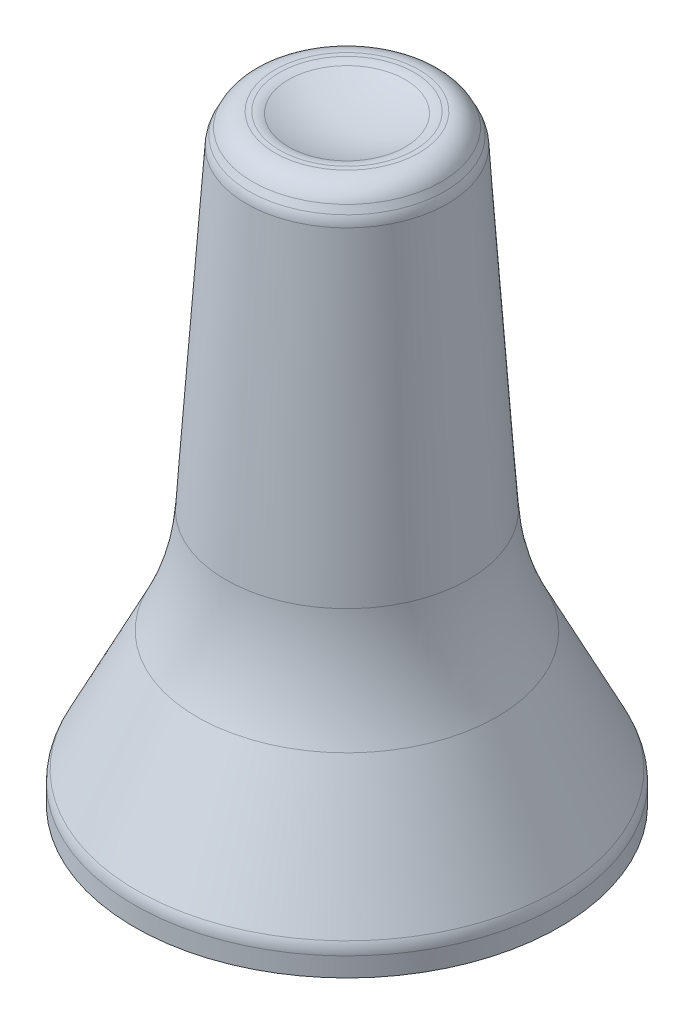
ISO-10303-21;
HEADER;
FILE_DESCRIPTION(('STEP AP214'),'2;1');
FILE_NAME('part.step','',(''),(''),'','','');
FILE_SCHEMA(('AUTOMOTIVE_DESIGN { 1 0 10303 214 1 1 1 1 }'));
ENDSEC;
DATA;
#1=APPLICATION_CONTEXT('core data for automotive mechanical design processes');
#2=APPLICATION_PROTOCOL_DEFINITION('international standard','automotive_design',2000,#1);
#3=PRODUCT_CONTEXT('',#1,'mechanical');
#4=PRODUCT('Part','Part','',(#3));
#5=PRODUCT_RELATED_PRODUCT_CATEGORY('part','',(#4));
#6=PRODUCT_DEFINITION_FORMATION('','',#4);
#7=PRODUCT_DEFINITION_CONTEXT('part definition',#1,'design');
#8=PRODUCT_DEFINITION('design','',#6,#7);
#9=PRODUCT_DEFINITION_SHAPE('','',#8);
#10=(LENGTH_UNIT() NAMED_UNIT(*) SI_UNIT(.MILLI.,.METRE.));
#11=(NAMED_UNIT(*) PLANE_ANGLE_UNIT() SI_UNIT($,.RADIAN.));
#12=(NAMED_UNIT(*) SI_UNIT($,.STERADIAN.) SOLID_ANGLE_UNIT());
#13=UNCERTAINTY_MEASURE_WITH_UNIT(LENGTH_MEASURE(1.E-05),#10,'distance_accuracy_value','');
#14=(GEOMETRIC_REPRESENTATION_CONTEXT(3) GLOBAL_UNCERTAINTY_ASSIGNED_CONTEXT((#13)) GLOBAL_UNIT_ASSIGNED_CONTEXT((#10,
#11,#12)) REPRESENTATION_CONTEXT('',''));
#15=CARTESIAN_POINT('',(0.,0.,0.));
#16=DIRECTION('',(0.,0.,1.));
#17=DIRECTION('',(1.,0.,0.));
#18=AXIS2_PLACEMENT_3D('',#15,#16,#17);
#19=CARTESIAN_POINT('',(0.,17.75,0.));
#20=DIRECTION('',(0.,1.,0.));
#21=DIRECTION('',(-1.,0.,0.));
#22=AXIS2_PLACEMENT_3D('',#19,#20,#21);
#23=CYLINDRICAL_SURFACE('',#22,3.05);
#24=CARTESIAN_POINT('',(0.,7.325,0.));
#25=DIRECTION('',(0.,1.,0.));
#26=DIRECTION('',(-1.,0.,0.));
#27=AXIS2_PLACEMENT_3D('',#24,#25,#26);
#28=CIRCLE('',#27,3.05);
#29=CARTESIAN_POINT('',(2.42487113059643,7.325,1.85));
#30=VERTEX_POINT('',#29);
#31=CARTESIAN_POINT('',(0.0999865618490292,7.325,-3.04836065573771));
#32=VERTEX_POINT('',#31);
#33=EDGE_CURVE('E105',#30,#32,#28,.T.);
#34=ORIENTED_EDGE('',*,*,#33,.F.);
#35=CARTESIAN_POINT('',(0.,9.175,0.));
#36=DIRECTION('',(0.,0.707106781186547,0.707106781186547));
#37=DIRECTION('',(0.,0.707106781186548,-0.707106781186548));
#38=AXIS2_PLACEMENT_3D('',#35,#36,#37);
#39=ELLIPSE('',#38,4.31335136523794,3.05);
#40=CARTESIAN_POINT('',(2.6556543449779,7.675,1.5));
#41=VERTEX_POINT('',#40);
#42=EDGE_CURVE('E11',#30,#41,#39,.T.);
#43=ORIENTED_EDGE('',*,*,#42,.T.);
#44=DIRECTION('',(0.,1.,0.));
#45=VECTOR('',#44,1.);
#46=CARTESIAN_POINT('',(2.6556543449779,1.79214359485084,1.5));
#47=LINE('',#46,#45);
#48=CARTESIAN_POINT('',(2.6556543449779,17.75,1.5));
#49=VERTEX_POINT('',#48);
#50=EDGE_CURVE('E79',#41,#49,#47,.T.);
#51=ORIENTED_EDGE('',*,*,#50,.T.);
#52=CARTESIAN_POINT('',(0.,17.75,0.));
#53=DIRECTION('',(0.,1.,0.));
#54=DIRECTION('',(-1.,0.,0.));
#55=AXIS2_PLACEMENT_3D('',#52,#53,#54);
#56=CIRCLE('',#55,3.05);
#57=CARTESIAN_POINT('',(0.0999865618490328,17.75,-3.04836065573771));
#58=VERTEX_POINT('',#57);
#59=EDGE_CURVE('E83',#49,#58,#56,.T.);
#60=ORIENTED_EDGE('',*,*,#59,.T.);
#61=DIRECTION('',(0.,1.,0.));
#62=VECTOR('',#61,1.);
#63=CARTESIAN_POINT('',(0.0999865618490293,1.79214359485084,-3.04836065573771));
#64=LINE('',#63,#62);
#65=EDGE_CURVE('E255',#32,#58,#64,.T.);
#66=ORIENTED_EDGE('',*,*,#65,.F.);
#67=EDGE_LOOP('',(#34,#43,#51,#60,#66));
#68=FACE_BOUND('',#67,.T.);
#69=ADVANCED_FACE('F33',(#68),#23,.F.);
#70=CARTESIAN_POINT('',(-0.0999865618490304,17.75,-3.04836065573771));
#71=VERTEX_POINT('',#70);
#72=CARTESIAN_POINT('',(-2.6556543449779,17.75,1.5));
#73=VERTEX_POINT('',#72);
#74=EDGE_CURVE('E102',#71,#73,#56,.T.);
#75=ORIENTED_EDGE('',*,*,#74,.T.);
#76=DIRECTION('',(0.,1.,0.));
#77=VECTOR('',#76,1.);
#78=CARTESIAN_POINT('',(-2.6556543449779,1.79214359485084,1.5));
#79=LINE('',#78,#77);
#80=CARTESIAN_POINT('',(-2.6556543449779,7.675,1.5));
#81=VERTEX_POINT('',#80);
#82=EDGE_CURVE('E89',#81,#73,#79,.T.);
#83=ORIENTED_EDGE('',*,*,#82,.F.);
#84=CARTESIAN_POINT('',(0.,9.175,0.));
#85=DIRECTION('',(0.,0.707106781186547,0.707106781186547));
#86=DIRECTION('',(0.,0.707106781186548,-0.707106781186548));
#87=AXIS2_PLACEMENT_3D('',#84,#85,#86);
#88=ELLIPSE('',#87,4.31335136523794,3.05);
#89=CARTESIAN_POINT('',(-2.42487113059643,7.325,1.85));
#90=VERTEX_POINT('',#89);
#91=EDGE_CURVE('E42',#81,#90,#88,.T.);
#92=ORIENTED_EDGE('',*,*,#91,.T.);
#93=CARTESIAN_POINT('',(-0.0999865618490304,7.325,-3.04836065573771));
#94=VERTEX_POINT('',#93);
#95=EDGE_CURVE('E48',#94,#90,#28,.T.);
#96=ORIENTED_EDGE('',*,*,#95,.F.);
#97=DIRECTION('',(0.,1.,0.));
#98=VECTOR('',#97,1.);
#99=CARTESIAN_POINT('',(-0.0999865618490304,1.79214359485084,-3.04836065573771));
#100=LINE('',#99,#98);
#101=EDGE_CURVE('E107',#94,#71,#100,.T.);
#102=ORIENTED_EDGE('',*,*,#101,.T.);
#103=EDGE_LOOP('',(#75,#83,#92,#96,#102));
#104=FACE_BOUND('',#103,.T.);
#105=ADVANCED_FACE('F187',(#104),#23,.F.);
#106=CARTESIAN_POINT('',(3.05,17.75,0.));
#107=DIRECTION('',(0.,-1.,0.));
#108=DIRECTION('',(1.,0.,0.));
#109=AXIS2_PLACEMENT_3D('',#106,#107,#108);
#110=PLANE('',#109);
#111=ORIENTED_EDGE('',*,*,#59,.F.);
#112=DIRECTION('',(1.,0.,0.));
#113=VECTOR('',#112,1.);
#114=CARTESIAN_POINT('',(-2.6556543449779,17.75,1.5));
#115=LINE('',#114,#113);
#116=EDGE_CURVE('E90',#73,#49,#115,.T.);
#117=ORIENTED_EDGE('',*,*,#116,.F.);
#118=ORIENTED_EDGE('',*,*,#74,.F.);
#119=CARTESIAN_POINT('',(0.,17.75,-3.05));
#120=DIRECTION('',(0.,-1.,0.));
#121=DIRECTION('',(1.,0.,0.));
#122=AXIS2_PLACEMENT_3D('',#119,#120,#121);
#123=CIRCLE('',#122,0.0999999999999998);
#124=EDGE_CURVE('E101',#58,#71,#123,.T.);
#125=ORIENTED_EDGE('',*,*,#124,.F.);
#126=EDGE_LOOP('',(#111,#117,#118,#125));
#127=FACE_BOUND('',#126,.T.);
#128=ADVANCED_FACE('F100',(#127),#110,.T.);
#129=CARTESIAN_POINT('',(0.,0.,0.));
#130=DIRECTION('',(0.,1.,0.));
#131=DIRECTION('',(-1.,0.,0.));
#132=AXIS2_PLACEMENT_3D('',#129,#130,#131);
#133=PLANE('',#132);
#134=CARTESIAN_POINT('',(0.,0.,0.));
#135=DIRECTION('',(0.,1.,0.));
#136=DIRECTION('',(-1.,0.,0.));
#137=AXIS2_PLACEMENT_3D('',#134,#135,#136);
#138=CIRCLE('',#137,3.875);
#139=CARTESIAN_POINT('',(-3.875,0.,0.));
#140=VERTEX_POINT('',#139);
#141=EDGE_CURVE('E117',#140,#140,#138,.T.);
#142=ORIENTED_EDGE('',*,*,#141,.T.);
#143=EDGE_LOOP('',(#142));
#144=FACE_BOUND('',#143,.T.);
#145=CARTESIAN_POINT('',(0.,0.,0.));
#146=DIRECTION('',(0.,1.,0.));
#147=DIRECTION('',(-1.,0.,0.));
#148=AXIS2_PLACEMENT_3D('',#145,#146,#147);
#149=CIRCLE('',#148,8.5);
#150=CARTESIAN_POINT('',(-8.5,0.,0.));
#151=VERTEX_POINT('',#150);
#152=EDGE_CURVE('E120',#151,#151,#149,.T.);
#153=ORIENTED_EDGE('',*,*,#152,.F.);
#154=EDGE_LOOP('',(#153));
#155=FACE_BOUND('',#154,.T.);
#156=ADVANCED_FACE('F157',(#144,#155),#133,.F.);
#157=CARTESIAN_POINT('',(0.,23.5,0.));
#158=DIRECTION('',(0.,1.,0.));
#159=DIRECTION('',(-1.,0.,0.));
#160=AXIS2_PLACEMENT_3D('',#157,#158,#159);
#161=CYLINDRICAL_SURFACE('',#160,8.5);
#162=CARTESIAN_POINT('',(0.,0.763932022500208,0.));
#163=DIRECTION('',(0.,-1.,0.));
#164=DIRECTION('',(1.,0.,0.));
#165=AXIS2_PLACEMENT_3D('',#162,#163,#164);
#166=CIRCLE('',#165,8.5);
#167=CARTESIAN_POINT('',(8.5,0.763932022500208,0.));
#168=VERTEX_POINT('',#167);
#169=EDGE_CURVE('E222',#168,#168,#166,.T.);
#170=ORIENTED_EDGE('',*,*,#169,.T.);
#171=EDGE_LOOP('',(#170));
#172=FACE_BOUND('',#171,.T.);
#173=ORIENTED_EDGE('',*,*,#152,.T.);
#174=EDGE_LOOP('',(#173));
#175=FACE_BOUND('',#174,.T.);
#176=ADVANCED_FACE('F153',(#172,#175),#161,.T.);
#177=CARTESIAN_POINT('',(0.,1.,0.));
#178=DIRECTION('',(0.,-1.,0.));
#179=DIRECTION('',(1.,0.,0.));
#180=AXIS2_PLACEMENT_3D('',#177,#178,#179);
#181=CONICAL_SURFACE('',#180,8.5,0.463647609000806);
#182=CARTESIAN_POINT('',(0.,1.21114561800017,0.));
#183=DIRECTION('',(0.,1.,0.));
#184=DIRECTION('',(-1.,0.,0.));
#185=AXIS2_PLACEMENT_3D('',#182,#183,#184);
#186=CIRCLE('',#185,8.39442719099992);
#187=CARTESIAN_POINT('',(-8.39442719099992,1.21114561800017,0.));
#188=VERTEX_POINT('',#187);
#189=EDGE_CURVE('E217',#188,#188,#186,.T.);
#190=ORIENTED_EDGE('',*,*,#189,.T.);
#191=EDGE_LOOP('',(#190));
#192=FACE_BOUND('',#191,.T.);
#193=CARTESIAN_POINT('',(0.,6.0205501389821,0.));
#194=DIRECTION('',(0.,-1.,0.));
#195=DIRECTION('',(1.,0.,0.));
#196=AXIS2_PLACEMENT_3D('',#193,#194,#195);
#197=CIRCLE('',#196,5.98972493050895);
#198=CARTESIAN_POINT('',(5.98972493050895,6.0205501389821,0.));
#199=VERTEX_POINT('',#198);
#200=EDGE_CURVE('E213',#199,#199,#197,.T.);
#201=ORIENTED_EDGE('',*,*,#200,.T.);
#202=EDGE_LOOP('',(#201));
#203=FACE_BOUND('',#202,.T.);
#204=ADVANCED_FACE('F149',(#192,#203),#181,.T.);
#205=CARTESIAN_POINT('',(0.,8.,0.));
#206=DIRECTION('',(0.,-1.,0.));
#207=DIRECTION('',(1.,0.,0.));
#208=AXIS2_PLACEMENT_3D('',#205,#206,#207);
#209=CONICAL_SURFACE('',#208,5.,0.0665681637758239);
#210=CARTESIAN_POINT('',(0.,22.7992554023891,0.));
#211=DIRECTION('',(0.,1.,0.));
#212=DIRECTION('',(-1.,0.,0.));
#213=AXIS2_PLACEMENT_3D('',#210,#211,#212);
#214=CIRCLE('',#213,4.01338297317406);
#215=CARTESIAN_POINT('',(-4.01338297317406,22.7992554023891,0.));
#216=VERTEX_POINT('',#215);
#217=EDGE_CURVE('E240',#216,#216,#214,.F.);
#218=ORIENTED_EDGE('',*,*,#217,.T.);
#219=EDGE_LOOP('',(#218));
#220=FACE_BOUND('',#219,.T.);
#221=CARTESIAN_POINT('',(0.,10.2081905737201,0.));
#222=DIRECTION('',(0.,-1.,0.));
#223=DIRECTION('',(1.,0.,0.));
#224=AXIS2_PLACEMENT_3D('',#221,#222,#223);
#225=CIRCLE('',#224,4.85278729508533);
#226=CARTESIAN_POINT('',(4.85278729508533,10.2081905737201,0.));
#227=VERTEX_POINT('',#226);
#228=EDGE_CURVE('E211',#227,#227,#225,.F.);
#229=ORIENTED_EDGE('',*,*,#228,.T.);
#230=EDGE_LOOP('',(#229));
#231=FACE_BOUND('',#230,.T.);
#232=ADVANCED_FACE('F145',(#220,#231),#209,.T.);
#233=CARTESIAN_POINT('',(0.,23.,0.));
#234=DIRECTION('',(0.,-1.,0.));
#235=DIRECTION('',(1.,0.,0.));
#236=AXIS2_PLACEMENT_3D('',#233,#234,#235);
#237=CONICAL_SURFACE('',#236,4.,0.463647609000806);
#238=CARTESIAN_POINT('',(0.,23.4472135955,0.));
#239=DIRECTION('',(0.,1.,0.));
#240=DIRECTION('',(-1.,0.,0.));
#241=AXIS2_PLACEMENT_3D('',#238,#239,#240);
#242=CIRCLE('',#241,3.77639320225002);
#243=CARTESIAN_POINT('',(-3.77639320225002,23.4472135955,0.));
#244=VERTEX_POINT('',#243);
#245=EDGE_CURVE('E237',#244,#244,#242,.F.);
#246=ORIENTED_EDGE('',*,*,#245,.T.);
#247=EDGE_LOOP('',(#246));
#248=FACE_BOUND('',#247,.T.);
#249=CARTESIAN_POINT('',(0.,23.1799499873653,0.));
#250=DIRECTION('',(0.,1.,0.));
#251=DIRECTION('',(-1.,0.,0.));
#252=AXIS2_PLACEMENT_3D('',#249,#250,#251);
#253=CIRCLE('',#252,3.91002500631737);
#254=CARTESIAN_POINT('',(-3.91002500631737,23.1799499873653,0.));
#255=VERTEX_POINT('',#254);
#256=EDGE_CURVE('E234',#255,#255,#253,.T.);
#257=ORIENTED_EDGE('',*,*,#256,.T.);
#258=EDGE_LOOP('',(#257));
#259=FACE_BOUND('',#258,.T.);
#260=ADVANCED_FACE('F141',(#248,#259),#237,.T.);
#261=CARTESIAN_POINT('',(3.5,24.,0.));
#262=DIRECTION('',(0.,-1.,0.));
#263=DIRECTION('',(1.,0.,0.));
#264=AXIS2_PLACEMENT_3D('',#261,#262,#263);
#265=PLANE('',#264);
#266=CARTESIAN_POINT('',(0.,24.,0.));
#267=DIRECTION('',(0.,-1.,0.));
#268=DIRECTION('',(1.,0.,0.));
#269=AXIS2_PLACEMENT_3D('',#266,#267,#268);
#270=CIRCLE('',#269,2.69281355125542);
#271=CARTESIAN_POINT('',(2.69281355125542,24.,0.));
#272=VERTEX_POINT('',#271);
#273=EDGE_CURVE('E231',#272,#272,#270,.T.);
#274=ORIENTED_EDGE('',*,*,#273,.T.);
#275=EDGE_LOOP('',(#274));
#276=FACE_BOUND('',#275,.T.);
#277=CARTESIAN_POINT('',(0.,24.,0.));
#278=DIRECTION('',(0.,-1.,0.));
#279=DIRECTION('',(1.,0.,0.));
#280=AXIS2_PLACEMENT_3D('',#277,#278,#279);
#281=CIRCLE('',#280,2.88196601125011);
#282=CARTESIAN_POINT('',(2.88196601125011,24.,0.));
#283=VERTEX_POINT('',#282);
#284=EDGE_CURVE('E228',#283,#283,#281,.F.);
#285=ORIENTED_EDGE('',*,*,#284,.T.);
#286=EDGE_LOOP('',(#285));
#287=FACE_BOUND('',#286,.T.);
#288=ADVANCED_FACE('F135',(#276,#287),#265,.F.);
#289=CARTESIAN_POINT('',(2.5,24.,0.));
#290=CARTESIAN_POINT('',(1.3,23.5,0.));
#291=CARTESIAN_POINT('',(0.,23.5,0.));
#292=B_SPLINE_CURVE_WITH_KNOTS('',2,(#289,#290,#291),.UNSPECIFIED.,.F.,.F.,(3,3),(0.,1.),.UNSPECIFIED.);
#293=CARTESIAN_POINT('',(0.,23.5,0.));
#294=DIRECTION('',(0.,1.,0.));
#295=AXIS1_PLACEMENT('',#293,#294);
#296=SURFACE_OF_REVOLUTION('',#292,#295);
#297=CARTESIAN_POINT('',(0.,23.9330553078539,0.));
#298=DIRECTION('',(0.,1.,0.));
#299=DIRECTION('',(-1.,0.,0.));
#300=AXIS2_PLACEMENT_3D('',#297,#298,#299);
#301=CIRCLE('',#300,2.33308060518872);
#302=CARTESIAN_POINT('',(-2.33308060518872,23.9330553078539,0.));
#303=VERTEX_POINT('',#302);
#304=EDGE_CURVE('E225',#303,#303,#301,.T.);
#305=ORIENTED_EDGE('',*,*,#304,.T.);
#306=EDGE_LOOP('',(#305));
#307=FACE_BOUND('',#306,.T.);
#308=CARTESIAN_POINT('',(0.,23.5,0.));
#309=VERTEX_POINT('',#308);
#310=VERTEX_LOOP('',#309);
#311=FACE_BOUND('',#310,.T.);
#312=ADVANCED_FACE('F130',(#307,#311),#296,.T.);
#313=CARTESIAN_POINT('',(0.,10.9398996894816,0.));
#314=DIRECTION('',(0.,1.,0.));
#315=DIRECTION('',(-1.,0.,0.));
#316=AXIS2_PLACEMENT_3D('',#313,#314,#315);
#317=TOROIDAL_SURFACE('',#316,15.828424031508,11.);
#318=ORIENTED_EDGE('',*,*,#200,.F.);
#319=EDGE_LOOP('',(#318));
#320=FACE_BOUND('',#319,.T.);
#321=ORIENTED_EDGE('',*,*,#228,.F.);
#322=EDGE_LOOP('',(#321));
#323=FACE_BOUND('',#322,.T.);
#324=ADVANCED_FACE('F134',(#320,#323),#317,.F.);
#325=CARTESIAN_POINT('',(0.,0.763932022500208,0.));
#326=DIRECTION('',(0.,-1.,0.));
#327=DIRECTION('',(1.,0.,0.));
#328=AXIS2_PLACEMENT_3D('',#325,#326,#327);
#329=TOROIDAL_SURFACE('',#328,7.5,1.);
#330=ORIENTED_EDGE('',*,*,#169,.F.);
#331=EDGE_LOOP('',(#330));
#332=FACE_BOUND('',#331,.T.);
#333=ORIENTED_EDGE('',*,*,#189,.F.);
#334=EDGE_LOOP('',(#333));
#335=FACE_BOUND('',#334,.T.);
#336=ADVANCED_FACE('F164',(#332,#335),#329,.T.);
#337=CARTESIAN_POINT('',(0.,23.0000000000001,0.));
#338=DIRECTION('',(0.,1.,0.));
#339=DIRECTION('',(-1.,0.,0.));
#340=AXIS2_PLACEMENT_3D('',#337,#338,#339);
#341=TOROIDAL_SURFACE('',#340,2.69281355125542,1.);
#342=ORIENTED_EDGE('',*,*,#273,.F.);
#343=EDGE_LOOP('',(#342));
#344=FACE_BOUND('',#343,.T.);
#345=ORIENTED_EDGE('',*,*,#304,.F.);
#346=EDGE_LOOP('',(#345));
#347=FACE_BOUND('',#346,.T.);
#348=ADVANCED_FACE('F168',(#344,#347),#341,.T.);
#349=CARTESIAN_POINT('',(0.,23.,0.));
#350=DIRECTION('',(0.,-1.,0.));
#351=DIRECTION('',(1.,0.,0.));
#352=AXIS2_PLACEMENT_3D('',#349,#350,#351);
#353=TOROIDAL_SURFACE('',#352,2.88196601125011,1.);
#354=ORIENTED_EDGE('',*,*,#245,.F.);
#355=EDGE_LOOP('',(#354));
#356=FACE_BOUND('',#355,.T.);
#357=ORIENTED_EDGE('',*,*,#284,.F.);
#358=EDGE_LOOP('',(#357));
#359=FACE_BOUND('',#358,.T.);
#360=ADVANCED_FACE('F172',(#356,#359),#353,.T.);
#361=CARTESIAN_POINT('',(0.,22.7327363918653,0.));
#362=DIRECTION('',(0.,-1.,0.));
#363=DIRECTION('',(1.,0.,0.));
#364=AXIS2_PLACEMENT_3D('',#361,#362,#363);
#365=TOROIDAL_SURFACE('',#364,3.01559781531745,1.);
#366=ORIENTED_EDGE('',*,*,#217,.F.);
#367=EDGE_LOOP('',(#366));
#368=FACE_BOUND('',#367,.T.);
#369=ORIENTED_EDGE('',*,*,#256,.F.);
#370=EDGE_LOOP('',(#369));
#371=FACE_BOUND('',#370,.T.);
#372=ADVANCED_FACE('F175',(#368,#371),#365,.T.);
#373=CARTESIAN_POINT('',(0.,17.75,0.));
#374=DIRECTION('',(0.,1.,0.));
#375=DIRECTION('',(-1.,0.,0.));
#376=AXIS2_PLACEMENT_3D('',#373,#374,#375);
#377=CYLINDRICAL_SURFACE('',#376,3.875);
#378=CARTESIAN_POINT('',(0.,6.5,0.));
#379=DIRECTION('',(0.,1.,0.));
#380=DIRECTION('',(-1.,0.,0.));
#381=AXIS2_PLACEMENT_3D('',#378,#379,#380);
#382=CIRCLE('',#381,3.875);
#383=CARTESIAN_POINT('',(-3.875,6.5,0.));
#384=VERTEX_POINT('',#383);
#385=EDGE_CURVE('E114',#384,#384,#382,.T.);
#386=ORIENTED_EDGE('',*,*,#385,.T.);
#387=EDGE_LOOP('',(#386));
#388=FACE_BOUND('',#387,.T.);
#389=ORIENTED_EDGE('',*,*,#141,.F.);
#390=EDGE_LOOP('',(#389));
#391=FACE_BOUND('',#390,.T.);
#392=ADVANCED_FACE('F137',(#388,#391),#377,.F.);
#393=CARTESIAN_POINT('',(0.,6.5,0.));
#394=DIRECTION('',(0.,-1.,0.));
#395=DIRECTION('',(1.,0.,0.));
#396=AXIS2_PLACEMENT_3D('',#393,#394,#395);
#397=CONICAL_SURFACE('',#396,3.875,0.785398163397448);
#398=EDGE_CURVE('E112',#32,#94,#28,.T.);
#399=ORIENTED_EDGE('',*,*,#398,.T.);
#400=ORIENTED_EDGE('',*,*,#95,.T.);
#401=CARTESIAN_POINT('',(0.,7.325,0.));
#402=DIRECTION('',(0.,1.,0.));
#403=DIRECTION('',(0.,0.,1.));
#404=AXIS2_PLACEMENT_3D('',#401,#402,#403);
#405=CIRCLE('',#404,3.05);
#406=EDGE_CURVE('E253',#90,#30,#405,.T.);
#407=ORIENTED_EDGE('',*,*,#406,.T.);
#408=ORIENTED_EDGE('',*,*,#33,.T.);
#409=EDGE_LOOP('',(#399,#400,#407,#408));
#410=FACE_BOUND('',#409,.T.);
#411=ORIENTED_EDGE('',*,*,#385,.F.);
#412=EDGE_LOOP('',(#411));
#413=FACE_BOUND('',#412,.T.);
#414=ADVANCED_FACE('F182',(#410,#413),#397,.F.);
#415=CARTESIAN_POINT('',(0.,1.79214359485084,-3.05));
#416=DIRECTION('',(0.,1.,0.));
#417=DIRECTION('',(-1.,0.,0.));
#418=AXIS2_PLACEMENT_3D('',#415,#416,#417);
#419=CYLINDRICAL_SURFACE('',#418,0.0999999999999998);
#420=ORIENTED_EDGE('',*,*,#101,.F.);
#421=CARTESIAN_POINT('',(0.,7.325,-3.05));
#422=DIRECTION('',(0.,1.,0.));
#423=DIRECTION('',(0.,0.,1.));
#424=AXIS2_PLACEMENT_3D('',#421,#422,#423);
#425=CIRCLE('',#424,0.0999999999999998);
#426=EDGE_CURVE('E103',#94,#32,#425,.T.);
#427=ORIENTED_EDGE('',*,*,#426,.T.);
#428=ORIENTED_EDGE('',*,*,#65,.T.);
#429=ORIENTED_EDGE('',*,*,#124,.T.);
#430=EDGE_LOOP('',(#420,#427,#428,#429));
#431=FACE_BOUND('',#430,.T.);
#432=ADVANCED_FACE('F196',(#431),#419,.T.);
#433=CARTESIAN_POINT('',(0.,7.325,0.));
#434=DIRECTION('',(0.,1.,0.));
#435=DIRECTION('',(0.,0.,1.));
#436=AXIS2_PLACEMENT_3D('',#433,#434,#435);
#437=PLANE('',#436);
#438=ORIENTED_EDGE('',*,*,#398,.F.);
#439=ORIENTED_EDGE('',*,*,#426,.F.);
#440=EDGE_LOOP('',(#438,#439));
#441=FACE_BOUND('',#440,.T.);
#442=ADVANCED_FACE('F200',(#441),#437,.F.);
#443=CARTESIAN_POINT('',(-2.6556543449779,1.79214359485084,1.5));
#444=DIRECTION('',(0.,0.,1.));
#445=DIRECTION('',(1.,0.,0.));
#446=AXIS2_PLACEMENT_3D('',#443,#444,#445);
#447=PLANE('',#446);
#448=ORIENTED_EDGE('',*,*,#50,.F.);
#449=DIRECTION('',(-1.,0.,0.));
#450=VECTOR('',#449,1.);
#451=CARTESIAN_POINT('',(-2.6556543449779,7.675,1.5));
#452=LINE('',#451,#450);
#453=EDGE_CURVE('E243',#41,#81,#452,.T.);
#454=ORIENTED_EDGE('',*,*,#453,.T.);
#455=ORIENTED_EDGE('',*,*,#82,.T.);
#456=ORIENTED_EDGE('',*,*,#116,.T.);
#457=EDGE_LOOP('',(#448,#454,#455,#456));
#458=FACE_BOUND('',#457,.T.);
#459=ADVANCED_FACE('F93',(#458),#447,.F.);
#460=CARTESIAN_POINT('',(0.,7.325,0.));
#461=DIRECTION('',(0.,1.,0.));
#462=DIRECTION('',(0.,0.,1.));
#463=AXIS2_PLACEMENT_3D('',#460,#461,#462);
#464=PLANE('',#463);
#465=ORIENTED_EDGE('',*,*,#406,.F.);
#466=DIRECTION('',(1.,0.,0.));
#467=VECTOR('',#466,1.);
#468=CARTESIAN_POINT('',(0.,7.325,1.85));
#469=LINE('',#468,#467);
#470=EDGE_CURVE('E245',#90,#30,#469,.T.);
#471=ORIENTED_EDGE('',*,*,#470,.T.);
#472=EDGE_LOOP('',(#465,#471));
#473=FACE_BOUND('',#472,.T.);
#474=ADVANCED_FACE('F252',(#473),#464,.F.);
#475=CARTESIAN_POINT('',(-2.6556543449779,7.675,1.5));
#476=DIRECTION('',(0.,0.707106781186547,0.707106781186547));
#477=DIRECTION('',(-1.,0.,0.));
#478=AXIS2_PLACEMENT_3D('',#475,#476,#477);
#479=PLANE('',#478);
#480=ORIENTED_EDGE('',*,*,#42,.F.);
#481=ORIENTED_EDGE('',*,*,#470,.F.);
#482=ORIENTED_EDGE('',*,*,#91,.F.);
#483=ORIENTED_EDGE('',*,*,#453,.F.);
#484=EDGE_LOOP('',(#480,#481,#482,#483));
#485=FACE_BOUND('',#484,.T.);
#486=ADVANCED_FACE('F35',(#485),#479,.F.);
#487=CLOSED_SHELL('',(#69,#105,#128,#156,#176,#204,#232,#260,#288,#312,#324,#336,#348,#360,#372,
#392,#414,#432,#442,#459,#474,#486));
#488=MANIFOLD_SOLID_BREP('B2',#487);
#489=ADVANCED_BREP_SHAPE_REPRESENTATION('',(#18,#488),#14);
#490=SHAPE_DEFINITION_REPRESENTATION(#9,#489);
ENDSEC;
END-ISO-10303-21;
